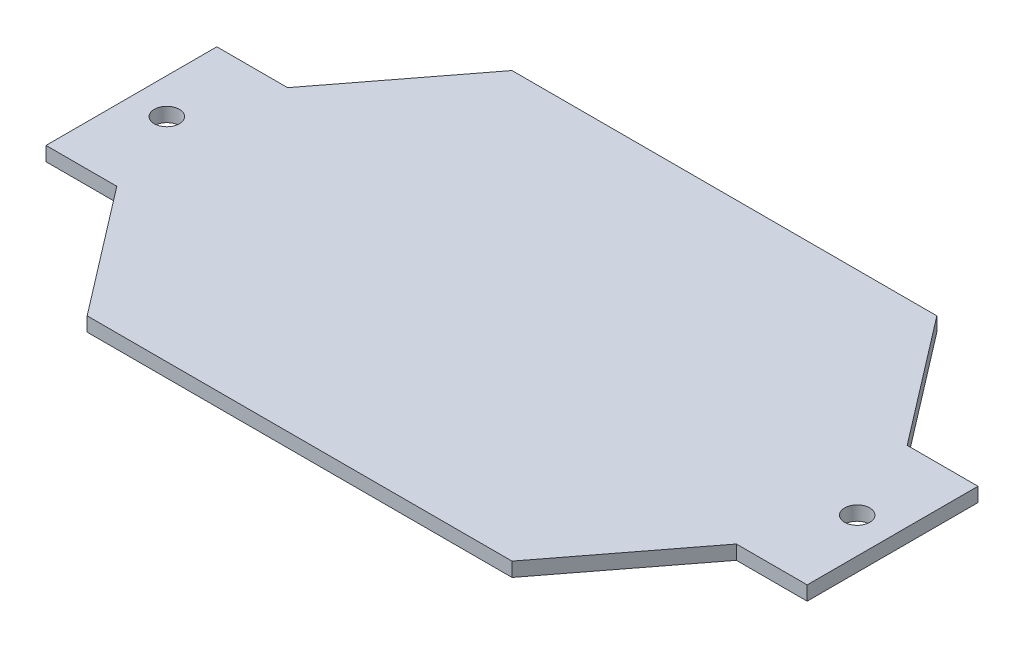
ISO-10303-21;
HEADER;
FILE_DESCRIPTION(('STEP AP214'),'2;1');
FILE_NAME('part.step','',(''),(''),'','','');
FILE_SCHEMA(('AUTOMOTIVE_DESIGN { 1 0 10303 214 1 1 1 1 }'));
ENDSEC;
DATA;
#1=APPLICATION_CONTEXT('core data for automotive mechanical design processes');
#2=APPLICATION_PROTOCOL_DEFINITION('international standard','automotive_design',2000,#1);
#3=PRODUCT_CONTEXT('',#1,'mechanical');
#4=PRODUCT('Part','Part','',(#3));
#5=PRODUCT_RELATED_PRODUCT_CATEGORY('part','',(#4));
#6=PRODUCT_DEFINITION_FORMATION('','',#4);
#7=PRODUCT_DEFINITION_CONTEXT('part definition',#1,'design');
#8=PRODUCT_DEFINITION('design','',#6,#7);
#9=PRODUCT_DEFINITION_SHAPE('','',#8);
#10=(LENGTH_UNIT() NAMED_UNIT(*) SI_UNIT(.MILLI.,.METRE.));
#11=(NAMED_UNIT(*) PLANE_ANGLE_UNIT() SI_UNIT($,.RADIAN.));
#12=(NAMED_UNIT(*) SI_UNIT($,.STERADIAN.) SOLID_ANGLE_UNIT());
#13=UNCERTAINTY_MEASURE_WITH_UNIT(LENGTH_MEASURE(1.E-05),#10,'distance_accuracy_value','');
#14=(GEOMETRIC_REPRESENTATION_CONTEXT(3) GLOBAL_UNCERTAINTY_ASSIGNED_CONTEXT((#13)) GLOBAL_UNIT_ASSIGNED_CONTEXT((#10,
#11,#12)) REPRESENTATION_CONTEXT('',''));
#15=CARTESIAN_POINT('',(0.,0.,0.));
#16=DIRECTION('',(0.,0.,1.));
#17=DIRECTION('',(1.,0.,0.));
#18=AXIS2_PLACEMENT_3D('',#15,#16,#17);
#19=CARTESIAN_POINT('',(0.,2.54,0.));
#20=DIRECTION('',(0.,-1.,0.));
#21=DIRECTION('',(0.,0.,-1.));
#22=AXIS2_PLACEMENT_3D('',#19,#20,#21);
#23=PLANE('',#22);
#24=DIRECTION('',(0.,0.,1.));
#25=VECTOR('',#24,1.);
#26=CARTESIAN_POINT('',(-6.35,2.54,15.3191568125633));
#27=LINE('',#26,#25);
#28=CARTESIAN_POINT('',(-6.35,2.54,-15.3191568125633));
#29=VERTEX_POINT('',#28);
#30=CARTESIAN_POINT('',(-6.35,2.54,15.3191568125633));
#31=VERTEX_POINT('',#30);
#32=EDGE_CURVE('E206',#29,#31,#27,.T.);
#33=ORIENTED_EDGE('',*,*,#32,.T.);
#34=DIRECTION('',(1.,0.,0.));
#35=VECTOR('',#34,1.);
#36=CARTESIAN_POINT('',(6.35,2.54,15.3191568125633));
#37=LINE('',#36,#35);
#38=CARTESIAN_POINT('',(6.35,2.54,15.3191568125633));
#39=VERTEX_POINT('',#38);
#40=EDGE_CURVE('E118',#31,#39,#37,.T.);
#41=ORIENTED_EDGE('',*,*,#40,.T.);
#42=DIRECTION('',(0.608369817215679,0.,0.79365368108575));
#43=VECTOR('',#42,1.);
#44=CARTESIAN_POINT('',(23.8125,2.54,38.1));
#45=LINE('',#44,#43);
#46=CARTESIAN_POINT('',(23.8125,2.54,38.1));
#47=VERTEX_POINT('',#46);
#48=EDGE_CURVE('E243',#39,#47,#45,.T.);
#49=ORIENTED_EDGE('',*,*,#48,.T.);
#50=DIRECTION('',(1.,0.,0.));
#51=VECTOR('',#50,1.);
#52=CARTESIAN_POINT('',(100.0125,2.54,38.1));
#53=LINE('',#52,#51);
#54=CARTESIAN_POINT('',(100.0125,2.54,38.1));
#55=VERTEX_POINT('',#54);
#56=EDGE_CURVE('E263',#47,#55,#53,.T.);
#57=ORIENTED_EDGE('',*,*,#56,.T.);
#58=DIRECTION('',(0.608369817215679,0.,-0.79365368108575));
#59=VECTOR('',#58,1.);
#60=CARTESIAN_POINT('',(100.0125,2.54,38.1));
#61=LINE('',#60,#59);
#62=CARTESIAN_POINT('',(117.475,2.54,15.3191568125633));
#63=VERTEX_POINT('',#62);
#64=EDGE_CURVE('E259',#55,#63,#61,.T.);
#65=ORIENTED_EDGE('',*,*,#64,.T.);
#66=DIRECTION('',(1.,0.,0.));
#67=VECTOR('',#66,1.);
#68=CARTESIAN_POINT('',(130.175,2.54,15.3191568125633));
#69=LINE('',#68,#67);
#70=CARTESIAN_POINT('',(130.175,2.54,15.3191568125633));
#71=VERTEX_POINT('',#70);
#72=EDGE_CURVE('E262',#63,#71,#69,.T.);
#73=ORIENTED_EDGE('',*,*,#72,.T.);
#74=DIRECTION('',(0.,0.,-1.));
#75=VECTOR('',#74,1.);
#76=CARTESIAN_POINT('',(130.175,2.54,-15.3191568125633));
#77=LINE('',#76,#75);
#78=CARTESIAN_POINT('',(130.175,2.54,-15.3191568125633));
#79=VERTEX_POINT('',#78);
#80=EDGE_CURVE('E267',#71,#79,#77,.T.);
#81=ORIENTED_EDGE('',*,*,#80,.T.);
#82=DIRECTION('',(-1.,0.,0.));
#83=VECTOR('',#82,1.);
#84=CARTESIAN_POINT('',(117.475,2.54,-15.3191568125633));
#85=LINE('',#84,#83);
#86=CARTESIAN_POINT('',(117.475,2.54,-15.3191568125633));
#87=VERTEX_POINT('',#86);
#88=EDGE_CURVE('E274',#79,#87,#85,.T.);
#89=ORIENTED_EDGE('',*,*,#88,.T.);
#90=DIRECTION('',(-0.608369817215679,0.,-0.79365368108575));
#91=VECTOR('',#90,1.);
#92=CARTESIAN_POINT('',(100.0125,2.54,-38.1));
#93=LINE('',#92,#91);
#94=CARTESIAN_POINT('',(100.0125,2.54,-38.1));
#95=VERTEX_POINT('',#94);
#96=EDGE_CURVE('E149',#87,#95,#93,.T.);
#97=ORIENTED_EDGE('',*,*,#96,.T.);
#98=DIRECTION('',(-1.,0.,0.));
#99=VECTOR('',#98,1.);
#100=CARTESIAN_POINT('',(23.8125,2.54,-38.1));
#101=LINE('',#100,#99);
#102=CARTESIAN_POINT('',(23.8125,2.54,-38.1));
#103=VERTEX_POINT('',#102);
#104=EDGE_CURVE('E143',#95,#103,#101,.T.);
#105=ORIENTED_EDGE('',*,*,#104,.T.);
#106=DIRECTION('',(-0.608369817215679,0.,0.79365368108575));
#107=VECTOR('',#106,1.);
#108=CARTESIAN_POINT('',(6.35,2.54,-15.3191568125633));
#109=LINE('',#108,#107);
#110=CARTESIAN_POINT('',(6.35,2.54,-15.3191568125633));
#111=VERTEX_POINT('',#110);
#112=EDGE_CURVE('E147',#103,#111,#109,.T.);
#113=ORIENTED_EDGE('',*,*,#112,.T.);
#114=DIRECTION('',(-1.,0.,0.));
#115=VECTOR('',#114,1.);
#116=CARTESIAN_POINT('',(-6.35,2.54,-15.3191568125633));
#117=LINE('',#116,#115);
#118=EDGE_CURVE('E63',#111,#29,#117,.T.);
#119=ORIENTED_EDGE('',*,*,#118,.T.);
#120=EDGE_LOOP('',(#33,#41,#49,#57,#65,#73,#81,#89,#97,#105,#113,#119));
#121=FACE_BOUND('',#120,.T.);
#122=CARTESIAN_POINT('',(0.,2.54,0.));
#123=DIRECTION('',(0.,1.,0.));
#124=DIRECTION('',(0.,0.,1.));
#125=AXIS2_PLACEMENT_3D('',#122,#123,#124);
#126=CIRCLE('',#125,2.25);
#127=CARTESIAN_POINT('',(0.,2.54,2.25));
#128=VERTEX_POINT('',#127);
#129=EDGE_CURVE('E176',#128,#128,#126,.T.);
#130=ORIENTED_EDGE('',*,*,#129,.F.);
#131=EDGE_LOOP('',(#130));
#132=FACE_BOUND('',#131,.T.);
#133=CARTESIAN_POINT('',(123.825,2.54,0.));
#134=DIRECTION('',(0.,1.,0.));
#135=DIRECTION('',(0.,0.,1.));
#136=AXIS2_PLACEMENT_3D('',#133,#134,#135);
#137=CIRCLE('',#136,2.25000000000001);
#138=CARTESIAN_POINT('',(123.825,2.54,2.25000000000001));
#139=VERTEX_POINT('',#138);
#140=EDGE_CURVE('E317',#139,#139,#137,.T.);
#141=ORIENTED_EDGE('',*,*,#140,.F.);
#142=EDGE_LOOP('',(#141));
#143=FACE_BOUND('',#142,.T.);
#144=ADVANCED_FACE('F45',(#121,#132,#143),#23,.F.);
#145=CARTESIAN_POINT('',(0.,0.,0.));
#146=DIRECTION('',(0.,-1.,0.));
#147=DIRECTION('',(0.,0.,-1.));
#148=AXIS2_PLACEMENT_3D('',#145,#146,#147);
#149=PLANE('',#148);
#150=CARTESIAN_POINT('',(0.,0.,0.));
#151=DIRECTION('',(0.,1.,0.));
#152=DIRECTION('',(0.,0.,1.));
#153=AXIS2_PLACEMENT_3D('',#150,#151,#152);
#154=CIRCLE('',#153,2.25);
#155=CARTESIAN_POINT('',(0.,0.,2.25));
#156=VERTEX_POINT('',#155);
#157=EDGE_CURVE('E324',#156,#156,#154,.T.);
#158=ORIENTED_EDGE('',*,*,#157,.T.);
#159=EDGE_LOOP('',(#158));
#160=FACE_BOUND('',#159,.T.);
#161=DIRECTION('',(0.,0.,1.));
#162=VECTOR('',#161,1.);
#163=CARTESIAN_POINT('',(-6.35,0.,15.3191568125633));
#164=LINE('',#163,#162);
#165=CARTESIAN_POINT('',(-6.35,0.,-15.3191568125633));
#166=VERTEX_POINT('',#165);
#167=CARTESIAN_POINT('',(-6.35,0.,15.3191568125633));
#168=VERTEX_POINT('',#167);
#169=EDGE_CURVE('E171',#166,#168,#164,.T.);
#170=ORIENTED_EDGE('',*,*,#169,.F.);
#171=DIRECTION('',(-1.,0.,0.));
#172=VECTOR('',#171,1.);
#173=CARTESIAN_POINT('',(-6.35,0.,-15.3191568125633));
#174=LINE('',#173,#172);
#175=CARTESIAN_POINT('',(6.35,0.,-15.3191568125633));
#176=VERTEX_POINT('',#175);
#177=EDGE_CURVE('E110',#176,#166,#174,.T.);
#178=ORIENTED_EDGE('',*,*,#177,.F.);
#179=DIRECTION('',(-0.608369817215679,0.,0.79365368108575));
#180=VECTOR('',#179,1.);
#181=CARTESIAN_POINT('',(6.35,0.,-15.3191568125633));
#182=LINE('',#181,#180);
#183=CARTESIAN_POINT('',(23.8125,0.,-38.1));
#184=VERTEX_POINT('',#183);
#185=EDGE_CURVE('E104',#184,#176,#182,.T.);
#186=ORIENTED_EDGE('',*,*,#185,.F.);
#187=DIRECTION('',(-1.,0.,0.));
#188=VECTOR('',#187,1.);
#189=CARTESIAN_POINT('',(23.8125,0.,-38.1));
#190=LINE('',#189,#188);
#191=CARTESIAN_POINT('',(100.0125,0.,-38.1));
#192=VERTEX_POINT('',#191);
#193=EDGE_CURVE('E158',#192,#184,#190,.T.);
#194=ORIENTED_EDGE('',*,*,#193,.F.);
#195=DIRECTION('',(-0.608369817215679,0.,-0.79365368108575));
#196=VECTOR('',#195,1.);
#197=CARTESIAN_POINT('',(100.0125,0.,-38.1));
#198=LINE('',#197,#196);
#199=CARTESIAN_POINT('',(117.475,0.,-15.3191568125633));
#200=VERTEX_POINT('',#199);
#201=EDGE_CURVE('E197',#200,#192,#198,.T.);
#202=ORIENTED_EDGE('',*,*,#201,.F.);
#203=DIRECTION('',(-1.,0.,0.));
#204=VECTOR('',#203,1.);
#205=CARTESIAN_POINT('',(117.475,0.,-15.3191568125633));
#206=LINE('',#205,#204);
#207=CARTESIAN_POINT('',(130.175,0.,-15.3191568125633));
#208=VERTEX_POINT('',#207);
#209=EDGE_CURVE('E194',#208,#200,#206,.T.);
#210=ORIENTED_EDGE('',*,*,#209,.F.);
#211=DIRECTION('',(0.,0.,-1.));
#212=VECTOR('',#211,1.);
#213=CARTESIAN_POINT('',(130.175,0.,-15.3191568125633));
#214=LINE('',#213,#212);
#215=CARTESIAN_POINT('',(130.175,0.,15.3191568125633));
#216=VERTEX_POINT('',#215);
#217=EDGE_CURVE('E191',#216,#208,#214,.T.);
#218=ORIENTED_EDGE('',*,*,#217,.F.);
#219=DIRECTION('',(1.,0.,0.));
#220=VECTOR('',#219,1.);
#221=CARTESIAN_POINT('',(130.175,0.,15.3191568125633));
#222=LINE('',#221,#220);
#223=CARTESIAN_POINT('',(117.475,0.,15.3191568125633));
#224=VERTEX_POINT('',#223);
#225=EDGE_CURVE('E188',#224,#216,#222,.T.);
#226=ORIENTED_EDGE('',*,*,#225,.F.);
#227=DIRECTION('',(0.608369817215679,0.,-0.79365368108575));
#228=VECTOR('',#227,1.);
#229=CARTESIAN_POINT('',(100.0125,0.,38.1));
#230=LINE('',#229,#228);
#231=CARTESIAN_POINT('',(100.0125,0.,38.1));
#232=VERTEX_POINT('',#231);
#233=EDGE_CURVE('E185',#232,#224,#230,.T.);
#234=ORIENTED_EDGE('',*,*,#233,.F.);
#235=DIRECTION('',(1.,0.,0.));
#236=VECTOR('',#235,1.);
#237=CARTESIAN_POINT('',(100.0125,0.,38.1));
#238=LINE('',#237,#236);
#239=CARTESIAN_POINT('',(23.8125,0.,38.1));
#240=VERTEX_POINT('',#239);
#241=EDGE_CURVE('E182',#240,#232,#238,.T.);
#242=ORIENTED_EDGE('',*,*,#241,.F.);
#243=DIRECTION('',(0.608369817215679,0.,0.79365368108575));
#244=VECTOR('',#243,1.);
#245=CARTESIAN_POINT('',(23.8125,0.,38.1));
#246=LINE('',#245,#244);
#247=CARTESIAN_POINT('',(6.35,0.,15.3191568125633));
#248=VERTEX_POINT('',#247);
#249=EDGE_CURVE('E179',#248,#240,#246,.T.);
#250=ORIENTED_EDGE('',*,*,#249,.F.);
#251=DIRECTION('',(1.,0.,0.));
#252=VECTOR('',#251,1.);
#253=CARTESIAN_POINT('',(6.35,0.,15.3191568125633));
#254=LINE('',#253,#252);
#255=EDGE_CURVE('E175',#168,#248,#254,.T.);
#256=ORIENTED_EDGE('',*,*,#255,.F.);
#257=EDGE_LOOP('',(#170,#178,#186,#194,#202,#210,#218,#226,#234,#242,#250,#256));
#258=FACE_BOUND('',#257,.T.);
#259=CARTESIAN_POINT('',(123.825,0.,0.));
#260=DIRECTION('',(0.,1.,0.));
#261=DIRECTION('',(0.,0.,1.));
#262=AXIS2_PLACEMENT_3D('',#259,#260,#261);
#263=CIRCLE('',#262,2.25000000000001);
#264=CARTESIAN_POINT('',(123.825,0.,2.25000000000001));
#265=VERTEX_POINT('',#264);
#266=EDGE_CURVE('E320',#265,#265,#263,.T.);
#267=ORIENTED_EDGE('',*,*,#266,.T.);
#268=EDGE_LOOP('',(#267));
#269=FACE_BOUND('',#268,.T.);
#270=ADVANCED_FACE('F247',(#160,#258,#269),#149,.T.);
#271=CARTESIAN_POINT('',(-6.35,2.54,15.3191568125633));
#272=DIRECTION('',(1.,0.,0.));
#273=DIRECTION('',(0.,0.,-1.));
#274=AXIS2_PLACEMENT_3D('',#271,#272,#273);
#275=PLANE('',#274);
#276=ORIENTED_EDGE('',*,*,#169,.T.);
#277=DIRECTION('',(0.,-1.,0.));
#278=VECTOR('',#277,1.);
#279=CARTESIAN_POINT('',(-6.35,2.54,15.3191568125633));
#280=LINE('',#279,#278);
#281=EDGE_CURVE('E11',#31,#168,#280,.T.);
#282=ORIENTED_EDGE('',*,*,#281,.F.);
#283=ORIENTED_EDGE('',*,*,#32,.F.);
#284=DIRECTION('',(0.,-1.,0.));
#285=VECTOR('',#284,1.);
#286=CARTESIAN_POINT('',(-6.35,2.54,-15.3191568125633));
#287=LINE('',#286,#285);
#288=EDGE_CURVE('E167',#29,#166,#287,.T.);
#289=ORIENTED_EDGE('',*,*,#288,.T.);
#290=EDGE_LOOP('',(#276,#282,#283,#289));
#291=FACE_BOUND('',#290,.T.);
#292=ADVANCED_FACE('F47',(#291),#275,.F.);
#293=CARTESIAN_POINT('',(6.35,2.54,15.3191568125633));
#294=DIRECTION('',(0.,0.,-1.));
#295=DIRECTION('',(-1.,0.,0.));
#296=AXIS2_PLACEMENT_3D('',#293,#294,#295);
#297=PLANE('',#296);
#298=ORIENTED_EDGE('',*,*,#255,.T.);
#299=DIRECTION('',(0.,-1.,0.));
#300=VECTOR('',#299,1.);
#301=CARTESIAN_POINT('',(6.35,2.54,15.3191568125633));
#302=LINE('',#301,#300);
#303=EDGE_CURVE('E55',#39,#248,#302,.T.);
#304=ORIENTED_EDGE('',*,*,#303,.F.);
#305=ORIENTED_EDGE('',*,*,#40,.F.);
#306=ORIENTED_EDGE('',*,*,#281,.T.);
#307=EDGE_LOOP('',(#298,#304,#305,#306));
#308=FACE_BOUND('',#307,.T.);
#309=ADVANCED_FACE('F426',(#308),#297,.F.);
#310=CARTESIAN_POINT('',(23.8125,2.54,38.1));
#311=DIRECTION('',(0.79365368108575,0.,-0.608369817215679));
#312=DIRECTION('',(-0.608369817215679,0.,-0.79365368108575));
#313=AXIS2_PLACEMENT_3D('',#310,#311,#312);
#314=PLANE('',#313);
#315=ORIENTED_EDGE('',*,*,#249,.T.);
#316=DIRECTION('',(0.,-1.,0.));
#317=VECTOR('',#316,1.);
#318=CARTESIAN_POINT('',(23.8125,2.54,38.1));
#319=LINE('',#318,#317);
#320=EDGE_CURVE('E233',#47,#240,#319,.T.);
#321=ORIENTED_EDGE('',*,*,#320,.F.);
#322=ORIENTED_EDGE('',*,*,#48,.F.);
#323=ORIENTED_EDGE('',*,*,#303,.T.);
#324=EDGE_LOOP('',(#315,#321,#322,#323));
#325=FACE_BOUND('',#324,.T.);
#326=ADVANCED_FACE('F241',(#325),#314,.F.);
#327=CARTESIAN_POINT('',(100.0125,2.54,38.1));
#328=DIRECTION('',(0.,0.,-1.));
#329=DIRECTION('',(-1.,0.,0.));
#330=AXIS2_PLACEMENT_3D('',#327,#328,#329);
#331=PLANE('',#330);
#332=ORIENTED_EDGE('',*,*,#241,.T.);
#333=DIRECTION('',(0.,-1.,0.));
#334=VECTOR('',#333,1.);
#335=CARTESIAN_POINT('',(100.0125,2.54,38.1));
#336=LINE('',#335,#334);
#337=EDGE_CURVE('E229',#55,#232,#336,.T.);
#338=ORIENTED_EDGE('',*,*,#337,.F.);
#339=ORIENTED_EDGE('',*,*,#56,.F.);
#340=ORIENTED_EDGE('',*,*,#320,.T.);
#341=EDGE_LOOP('',(#332,#338,#339,#340));
#342=FACE_BOUND('',#341,.T.);
#343=ADVANCED_FACE('F253',(#342),#331,.F.);
#344=CARTESIAN_POINT('',(100.0125,2.54,38.1));
#345=DIRECTION('',(-0.79365368108575,0.,-0.608369817215679));
#346=DIRECTION('',(-0.608369817215679,0.,0.79365368108575));
#347=AXIS2_PLACEMENT_3D('',#344,#345,#346);
#348=PLANE('',#347);
#349=ORIENTED_EDGE('',*,*,#233,.T.);
#350=DIRECTION('',(0.,-1.,0.));
#351=VECTOR('',#350,1.);
#352=CARTESIAN_POINT('',(117.475,2.54,15.3191568125633));
#353=LINE('',#352,#351);
#354=EDGE_CURVE('E225',#63,#224,#353,.T.);
#355=ORIENTED_EDGE('',*,*,#354,.F.);
#356=ORIENTED_EDGE('',*,*,#64,.F.);
#357=ORIENTED_EDGE('',*,*,#337,.T.);
#358=EDGE_LOOP('',(#349,#355,#356,#357));
#359=FACE_BOUND('',#358,.T.);
#360=ADVANCED_FACE('F257',(#359),#348,.F.);
#361=CARTESIAN_POINT('',(130.175,2.54,15.3191568125633));
#362=DIRECTION('',(0.,0.,-1.));
#363=DIRECTION('',(-1.,0.,0.));
#364=AXIS2_PLACEMENT_3D('',#361,#362,#363);
#365=PLANE('',#364);
#366=ORIENTED_EDGE('',*,*,#225,.T.);
#367=DIRECTION('',(0.,-1.,0.));
#368=VECTOR('',#367,1.);
#369=CARTESIAN_POINT('',(130.175,2.54,15.3191568125633));
#370=LINE('',#369,#368);
#371=EDGE_CURVE('E221',#71,#216,#370,.T.);
#372=ORIENTED_EDGE('',*,*,#371,.F.);
#373=ORIENTED_EDGE('',*,*,#72,.F.);
#374=ORIENTED_EDGE('',*,*,#354,.T.);
#375=EDGE_LOOP('',(#366,#372,#373,#374));
#376=FACE_BOUND('',#375,.T.);
#377=ADVANCED_FACE('F391',(#376),#365,.F.);
#378=CARTESIAN_POINT('',(130.175,2.54,-15.3191568125633));
#379=DIRECTION('',(-1.,0.,0.));
#380=DIRECTION('',(0.,0.,1.));
#381=AXIS2_PLACEMENT_3D('',#378,#379,#380);
#382=PLANE('',#381);
#383=ORIENTED_EDGE('',*,*,#217,.T.);
#384=DIRECTION('',(0.,-1.,0.));
#385=VECTOR('',#384,1.);
#386=CARTESIAN_POINT('',(130.175,2.54,-15.3191568125633));
#387=LINE('',#386,#385);
#388=EDGE_CURVE('E217',#79,#208,#387,.T.);
#389=ORIENTED_EDGE('',*,*,#388,.F.);
#390=ORIENTED_EDGE('',*,*,#80,.F.);
#391=ORIENTED_EDGE('',*,*,#371,.T.);
#392=EDGE_LOOP('',(#383,#389,#390,#391));
#393=FACE_BOUND('',#392,.T.);
#394=ADVANCED_FACE('F382',(#393),#382,.F.);
#395=CARTESIAN_POINT('',(117.475,2.54,-15.3191568125633));
#396=DIRECTION('',(0.,0.,1.));
#397=DIRECTION('',(1.,0.,0.));
#398=AXIS2_PLACEMENT_3D('',#395,#396,#397);
#399=PLANE('',#398);
#400=ORIENTED_EDGE('',*,*,#209,.T.);
#401=DIRECTION('',(0.,-1.,0.));
#402=VECTOR('',#401,1.);
#403=CARTESIAN_POINT('',(117.475,2.54,-15.3191568125633));
#404=LINE('',#403,#402);
#405=EDGE_CURVE('E213',#87,#200,#404,.T.);
#406=ORIENTED_EDGE('',*,*,#405,.F.);
#407=ORIENTED_EDGE('',*,*,#88,.F.);
#408=ORIENTED_EDGE('',*,*,#388,.T.);
#409=EDGE_LOOP('',(#400,#406,#407,#408));
#410=FACE_BOUND('',#409,.T.);
#411=ADVANCED_FACE('F282',(#410),#399,.F.);
#412=CARTESIAN_POINT('',(100.0125,2.54,-38.1));
#413=DIRECTION('',(-0.79365368108575,0.,0.608369817215679));
#414=DIRECTION('',(0.608369817215679,0.,0.79365368108575));
#415=AXIS2_PLACEMENT_3D('',#412,#413,#414);
#416=PLANE('',#415);
#417=ORIENTED_EDGE('',*,*,#201,.T.);
#418=DIRECTION('',(0.,-1.,0.));
#419=VECTOR('',#418,1.);
#420=CARTESIAN_POINT('',(100.0125,2.54,-38.1));
#421=LINE('',#420,#419);
#422=EDGE_CURVE('E160',#95,#192,#421,.T.);
#423=ORIENTED_EDGE('',*,*,#422,.F.);
#424=ORIENTED_EDGE('',*,*,#96,.F.);
#425=ORIENTED_EDGE('',*,*,#405,.T.);
#426=EDGE_LOOP('',(#417,#423,#424,#425));
#427=FACE_BOUND('',#426,.T.);
#428=ADVANCED_FACE('F286',(#427),#416,.F.);
#429=CARTESIAN_POINT('',(23.8125,2.54,-38.1));
#430=DIRECTION('',(0.,0.,1.));
#431=DIRECTION('',(1.,0.,0.));
#432=AXIS2_PLACEMENT_3D('',#429,#430,#431);
#433=PLANE('',#432);
#434=ORIENTED_EDGE('',*,*,#193,.T.);
#435=DIRECTION('',(0.,-1.,0.));
#436=VECTOR('',#435,1.);
#437=CARTESIAN_POINT('',(23.8125,2.54,-38.1));
#438=LINE('',#437,#436);
#439=EDGE_CURVE('E155',#103,#184,#438,.T.);
#440=ORIENTED_EDGE('',*,*,#439,.F.);
#441=ORIENTED_EDGE('',*,*,#104,.F.);
#442=ORIENTED_EDGE('',*,*,#422,.T.);
#443=EDGE_LOOP('',(#434,#440,#441,#442));
#444=FACE_BOUND('',#443,.T.);
#445=ADVANCED_FACE('F156',(#444),#433,.F.);
#446=CARTESIAN_POINT('',(6.35,2.54,-15.3191568125633));
#447=DIRECTION('',(0.79365368108575,0.,0.608369817215679));
#448=DIRECTION('',(0.608369817215679,0.,-0.79365368108575));
#449=AXIS2_PLACEMENT_3D('',#446,#447,#448);
#450=PLANE('',#449);
#451=ORIENTED_EDGE('',*,*,#185,.T.);
#452=DIRECTION('',(0.,-1.,0.));
#453=VECTOR('',#452,1.);
#454=CARTESIAN_POINT('',(6.35,2.54,-15.3191568125633));
#455=LINE('',#454,#453);
#456=EDGE_CURVE('E161',#111,#176,#455,.T.);
#457=ORIENTED_EDGE('',*,*,#456,.F.);
#458=ORIENTED_EDGE('',*,*,#112,.F.);
#459=ORIENTED_EDGE('',*,*,#439,.T.);
#460=EDGE_LOOP('',(#451,#457,#458,#459));
#461=FACE_BOUND('',#460,.T.);
#462=ADVANCED_FACE('F163',(#461),#450,.F.);
#463=CARTESIAN_POINT('',(-6.35,2.54,-15.3191568125633));
#464=DIRECTION('',(0.,0.,1.));
#465=DIRECTION('',(1.,0.,0.));
#466=AXIS2_PLACEMENT_3D('',#463,#464,#465);
#467=PLANE('',#466);
#468=ORIENTED_EDGE('',*,*,#177,.T.);
#469=ORIENTED_EDGE('',*,*,#288,.F.);
#470=ORIENTED_EDGE('',*,*,#118,.F.);
#471=ORIENTED_EDGE('',*,*,#456,.T.);
#472=EDGE_LOOP('',(#468,#469,#470,#471));
#473=FACE_BOUND('',#472,.T.);
#474=ADVANCED_FACE('F290',(#473),#467,.F.);
#475=CARTESIAN_POINT('',(0.,2.54,0.));
#476=DIRECTION('',(0.,-1.,0.));
#477=DIRECTION('',(0.,0.,-1.));
#478=AXIS2_PLACEMENT_3D('',#475,#476,#477);
#479=CYLINDRICAL_SURFACE('',#478,2.25);
#480=ORIENTED_EDGE('',*,*,#129,.T.);
#481=EDGE_LOOP('',(#480));
#482=FACE_BOUND('',#481,.T.);
#483=ORIENTED_EDGE('',*,*,#157,.F.);
#484=EDGE_LOOP('',(#483));
#485=FACE_BOUND('',#484,.T.);
#486=ADVANCED_FACE('F292',(#482,#485),#479,.F.);
#487=CARTESIAN_POINT('',(123.825,2.54,0.));
#488=DIRECTION('',(0.,-1.,0.));
#489=DIRECTION('',(0.,0.,-1.));
#490=AXIS2_PLACEMENT_3D('',#487,#488,#489);
#491=CYLINDRICAL_SURFACE('',#490,2.25000000000001);
#492=ORIENTED_EDGE('',*,*,#140,.T.);
#493=EDGE_LOOP('',(#492));
#494=FACE_BOUND('',#493,.T.);
#495=ORIENTED_EDGE('',*,*,#266,.F.);
#496=EDGE_LOOP('',(#495));
#497=FACE_BOUND('',#496,.T.);
#498=ADVANCED_FACE('F298',(#494,#497),#491,.F.);
#499=CLOSED_SHELL('',(#144,#270,#292,#309,#326,#343,#360,#377,#394,#411,#428,#445,#462,#474,
#486,#498));
#500=MANIFOLD_SOLID_BREP('B2',#499);
#501=ADVANCED_BREP_SHAPE_REPRESENTATION('',(#18,#500),#14);
#502=SHAPE_DEFINITION_REPRESENTATION(#9,#501);
ENDSEC;
END-ISO-10303-21;
